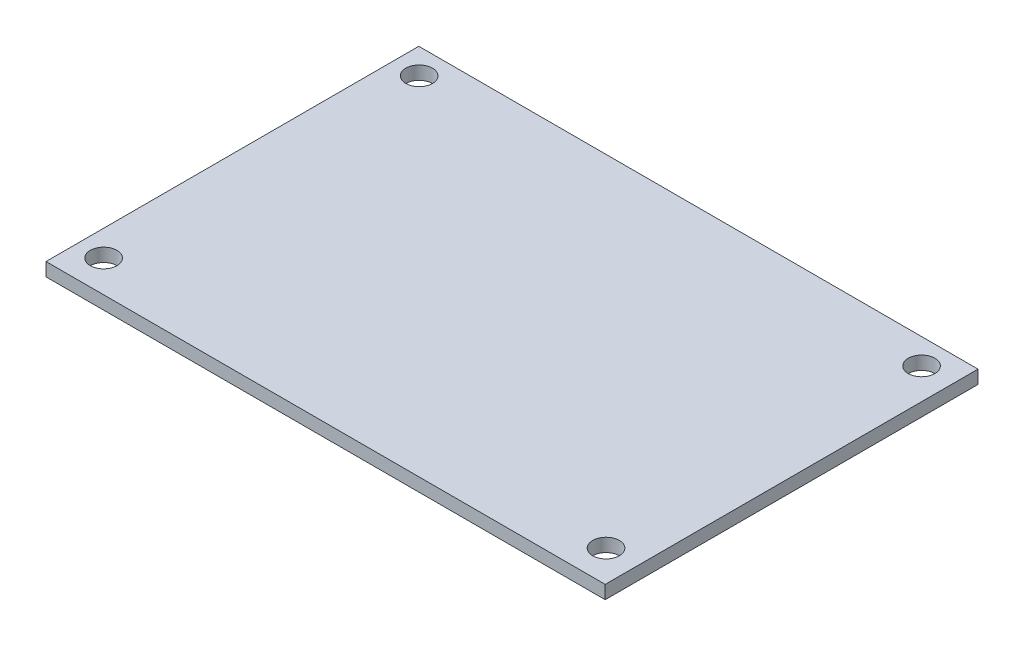
ISO-10303-21;
HEADER;
FILE_DESCRIPTION(('STEP AP214'),'2;1');
FILE_NAME('part.step','',(''),(''),'','','');
FILE_SCHEMA(('AUTOMOTIVE_DESIGN { 1 0 10303 214 1 1 1 1 }'));
ENDSEC;
DATA;
#1=APPLICATION_CONTEXT('core data for automotive mechanical design processes');
#2=APPLICATION_PROTOCOL_DEFINITION('international standard','automotive_design',2000,#1);
#3=PRODUCT_CONTEXT('',#1,'mechanical');
#4=PRODUCT('Part','Part','',(#3));
#5=PRODUCT_RELATED_PRODUCT_CATEGORY('part','',(#4));
#6=PRODUCT_DEFINITION_FORMATION('','',#4);
#7=PRODUCT_DEFINITION_CONTEXT('part definition',#1,'design');
#8=PRODUCT_DEFINITION('design','',#6,#7);
#9=PRODUCT_DEFINITION_SHAPE('','',#8);
#10=(LENGTH_UNIT() NAMED_UNIT(*) SI_UNIT(.MILLI.,.METRE.));
#11=(NAMED_UNIT(*) PLANE_ANGLE_UNIT() SI_UNIT($,.RADIAN.));
#12=(NAMED_UNIT(*) SI_UNIT($,.STERADIAN.) SOLID_ANGLE_UNIT());
#13=UNCERTAINTY_MEASURE_WITH_UNIT(LENGTH_MEASURE(1.E-05),#10,'distance_accuracy_value','');
#14=(GEOMETRIC_REPRESENTATION_CONTEXT(3) GLOBAL_UNCERTAINTY_ASSIGNED_CONTEXT((#13)) GLOBAL_UNIT_ASSIGNED_CONTEXT((#10,
#11,#12)) REPRESENTATION_CONTEXT('',''));
#15=CARTESIAN_POINT('',(0.,0.,0.));
#16=DIRECTION('',(0.,0.,1.));
#17=DIRECTION('',(1.,0.,0.));
#18=AXIS2_PLACEMENT_3D('',#15,#16,#17);
#19=CARTESIAN_POINT('',(31.5,1.5,-21.));
#20=DIRECTION('',(-1.,0.,0.));
#21=DIRECTION('',(0.,0.,1.));
#22=AXIS2_PLACEMENT_3D('',#19,#20,#21);
#23=PLANE('',#22);
#24=DIRECTION('',(0.,0.,-1.));
#25=VECTOR('',#24,1.);
#26=CARTESIAN_POINT('',(31.5,0.,-21.));
#27=LINE('',#26,#25);
#28=CARTESIAN_POINT('',(31.5,0.,21.));
#29=VERTEX_POINT('',#28);
#30=CARTESIAN_POINT('',(31.5,0.,-21.));
#31=VERTEX_POINT('',#30);
#32=EDGE_CURVE('E98',#29,#31,#27,.T.);
#33=ORIENTED_EDGE('',*,*,#32,.T.);
#34=DIRECTION('',(0.,-1.,0.));
#35=VECTOR('',#34,1.);
#36=CARTESIAN_POINT('',(31.5,1.5,-21.));
#37=LINE('',#36,#35);
#38=CARTESIAN_POINT('',(31.5,1.5,-21.));
#39=VERTEX_POINT('',#38);
#40=EDGE_CURVE('E11',#39,#31,#37,.T.);
#41=ORIENTED_EDGE('',*,*,#40,.F.);
#42=DIRECTION('',(0.,0.,-1.));
#43=VECTOR('',#42,1.);
#44=CARTESIAN_POINT('',(31.5,1.5,-21.));
#45=LINE('',#44,#43);
#46=CARTESIAN_POINT('',(31.5,1.5,21.));
#47=VERTEX_POINT('',#46);
#48=EDGE_CURVE('E86',#47,#39,#45,.T.);
#49=ORIENTED_EDGE('',*,*,#48,.F.);
#50=DIRECTION('',(0.,-1.,0.));
#51=VECTOR('',#50,1.);
#52=CARTESIAN_POINT('',(31.5,1.5,21.));
#53=LINE('',#52,#51);
#54=EDGE_CURVE('E94',#47,#29,#53,.T.);
#55=ORIENTED_EDGE('',*,*,#54,.T.);
#56=EDGE_LOOP('',(#33,#41,#49,#55));
#57=FACE_BOUND('',#56,.T.);
#58=ADVANCED_FACE('F35',(#57),#23,.F.);
#59=CARTESIAN_POINT('',(-31.5,1.5,-21.));
#60=DIRECTION('',(0.,0.,1.));
#61=DIRECTION('',(1.,0.,0.));
#62=AXIS2_PLACEMENT_3D('',#59,#60,#61);
#63=PLANE('',#62);
#64=DIRECTION('',(-1.,0.,0.));
#65=VECTOR('',#64,1.);
#66=CARTESIAN_POINT('',(-31.5,0.,-21.));
#67=LINE('',#66,#65);
#68=CARTESIAN_POINT('',(-31.5,0.,-21.));
#69=VERTEX_POINT('',#68);
#70=EDGE_CURVE('E90',#31,#69,#67,.T.);
#71=ORIENTED_EDGE('',*,*,#70,.T.);
#72=DIRECTION('',(0.,-1.,0.));
#73=VECTOR('',#72,1.);
#74=CARTESIAN_POINT('',(-31.5,1.5,-21.));
#75=LINE('',#74,#73);
#76=CARTESIAN_POINT('',(-31.5,1.5,-21.));
#77=VERTEX_POINT('',#76);
#78=EDGE_CURVE('E43',#77,#69,#75,.T.);
#79=ORIENTED_EDGE('',*,*,#78,.F.);
#80=DIRECTION('',(-1.,0.,0.));
#81=VECTOR('',#80,1.);
#82=CARTESIAN_POINT('',(-31.5,1.5,-21.));
#83=LINE('',#82,#81);
#84=EDGE_CURVE('E81',#39,#77,#83,.T.);
#85=ORIENTED_EDGE('',*,*,#84,.F.);
#86=ORIENTED_EDGE('',*,*,#40,.T.);
#87=EDGE_LOOP('',(#71,#79,#85,#86));
#88=FACE_BOUND('',#87,.T.);
#89=ADVANCED_FACE('F89',(#88),#63,.F.);
#90=CARTESIAN_POINT('',(-31.5,1.5,-21.));
#91=DIRECTION('',(1.,0.,0.));
#92=DIRECTION('',(0.,0.,-1.));
#93=AXIS2_PLACEMENT_3D('',#90,#91,#92);
#94=PLANE('',#93);
#95=DIRECTION('',(0.,0.,1.));
#96=VECTOR('',#95,1.);
#97=CARTESIAN_POINT('',(-31.5,0.,-21.));
#98=LINE('',#97,#96);
#99=CARTESIAN_POINT('',(-31.5,0.,21.));
#100=VERTEX_POINT('',#99);
#101=EDGE_CURVE('E68',#69,#100,#98,.T.);
#102=ORIENTED_EDGE('',*,*,#101,.T.);
#103=DIRECTION('',(0.,-1.,0.));
#104=VECTOR('',#103,1.);
#105=CARTESIAN_POINT('',(-31.5,1.5,21.));
#106=LINE('',#105,#104);
#107=CARTESIAN_POINT('',(-31.5,1.5,21.));
#108=VERTEX_POINT('',#107);
#109=EDGE_CURVE('E91',#108,#100,#106,.T.);
#110=ORIENTED_EDGE('',*,*,#109,.F.);
#111=DIRECTION('',(0.,0.,1.));
#112=VECTOR('',#111,1.);
#113=CARTESIAN_POINT('',(-31.5,1.5,-21.));
#114=LINE('',#113,#112);
#115=EDGE_CURVE('E84',#77,#108,#114,.T.);
#116=ORIENTED_EDGE('',*,*,#115,.F.);
#117=ORIENTED_EDGE('',*,*,#78,.T.);
#118=EDGE_LOOP('',(#102,#110,#116,#117));
#119=FACE_BOUND('',#118,.T.);
#120=ADVANCED_FACE('F92',(#119),#94,.F.);
#121=CARTESIAN_POINT('',(-31.5,1.5,21.));
#122=DIRECTION('',(0.,0.,-1.));
#123=DIRECTION('',(-1.,0.,0.));
#124=AXIS2_PLACEMENT_3D('',#121,#122,#123);
#125=PLANE('',#124);
#126=DIRECTION('',(1.,0.,0.));
#127=VECTOR('',#126,1.);
#128=CARTESIAN_POINT('',(-31.5,0.,21.));
#129=LINE('',#128,#127);
#130=EDGE_CURVE('E74',#100,#29,#129,.T.);
#131=ORIENTED_EDGE('',*,*,#130,.T.);
#132=ORIENTED_EDGE('',*,*,#54,.F.);
#133=DIRECTION('',(1.,0.,0.));
#134=VECTOR('',#133,1.);
#135=CARTESIAN_POINT('',(-31.5,1.5,21.));
#136=LINE('',#135,#134);
#137=EDGE_CURVE('E51',#108,#47,#136,.T.);
#138=ORIENTED_EDGE('',*,*,#137,.F.);
#139=ORIENTED_EDGE('',*,*,#109,.T.);
#140=EDGE_LOOP('',(#131,#132,#138,#139));
#141=FACE_BOUND('',#140,.T.);
#142=ADVANCED_FACE('F106',(#141),#125,.F.);
#143=CARTESIAN_POINT('',(0.,1.5,0.));
#144=DIRECTION('',(0.,1.,0.));
#145=DIRECTION('',(0.,0.,1.));
#146=AXIS2_PLACEMENT_3D('',#143,#144,#145);
#147=PLANE('',#146);
#148=CARTESIAN_POINT('',(-28.5975534976763,1.5,17.4143359028281));
#149=DIRECTION('',(0.,1.,0.));
#150=DIRECTION('',(0.,0.,1.));
#151=AXIS2_PLACEMENT_3D('',#148,#149,#150);
#152=CIRCLE('',#151,1.5);
#153=CARTESIAN_POINT('',(-28.5975534976763,1.5,18.9143359028281));
#154=VERTEX_POINT('',#153);
#155=EDGE_CURVE('E130',#154,#154,#152,.T.);
#156=ORIENTED_EDGE('',*,*,#155,.F.);
#157=EDGE_LOOP('',(#156));
#158=FACE_BOUND('',#157,.T.);
#159=CARTESIAN_POINT('',(28.007237026394,1.5,17.4143359028281));
#160=DIRECTION('',(0.,1.,0.));
#161=DIRECTION('',(0.,0.,1.));
#162=AXIS2_PLACEMENT_3D('',#159,#160,#161);
#163=CIRCLE('',#162,1.5);
#164=CARTESIAN_POINT('',(28.007237026394,1.5,18.9143359028281));
#165=VERTEX_POINT('',#164);
#166=EDGE_CURVE('E124',#165,#165,#163,.T.);
#167=ORIENTED_EDGE('',*,*,#166,.F.);
#168=EDGE_LOOP('',(#167));
#169=FACE_BOUND('',#168,.T.);
#170=CARTESIAN_POINT('',(28.007237026394,1.5,-18.1358338121731));
#171=DIRECTION('',(0.,1.,0.));
#172=DIRECTION('',(0.,0.,1.));
#173=AXIS2_PLACEMENT_3D('',#170,#171,#172);
#174=CIRCLE('',#173,1.5);
#175=CARTESIAN_POINT('',(28.007237026394,1.5,-16.6358338121731));
#176=VERTEX_POINT('',#175);
#177=EDGE_CURVE('E118',#176,#176,#174,.T.);
#178=ORIENTED_EDGE('',*,*,#177,.F.);
#179=EDGE_LOOP('',(#178));
#180=FACE_BOUND('',#179,.T.);
#181=CARTESIAN_POINT('',(-28.5975534976763,1.5,-18.1358338121731));
#182=DIRECTION('',(0.,1.,0.));
#183=DIRECTION('',(0.,0.,1.));
#184=AXIS2_PLACEMENT_3D('',#181,#182,#183);
#185=CIRCLE('',#184,1.5);
#186=CARTESIAN_POINT('',(-28.5975534976763,1.5,-16.6358338121731));
#187=VERTEX_POINT('',#186);
#188=EDGE_CURVE('E112',#187,#187,#185,.T.);
#189=ORIENTED_EDGE('',*,*,#188,.F.);
#190=EDGE_LOOP('',(#189));
#191=FACE_BOUND('',#190,.T.);
#192=ORIENTED_EDGE('',*,*,#48,.T.);
#193=ORIENTED_EDGE('',*,*,#84,.T.);
#194=ORIENTED_EDGE('',*,*,#115,.T.);
#195=ORIENTED_EDGE('',*,*,#137,.T.);
#196=EDGE_LOOP('',(#192,#193,#194,#195));
#197=FACE_BOUND('',#196,.T.);
#198=ADVANCED_FACE('F82',(#158,#169,#180,#191,#197),#147,.T.);
#199=CARTESIAN_POINT('',(0.,0.,0.));
#200=DIRECTION('',(0.,1.,0.));
#201=DIRECTION('',(0.,0.,1.));
#202=AXIS2_PLACEMENT_3D('',#199,#200,#201);
#203=PLANE('',#202);
#204=CARTESIAN_POINT('',(-28.5975534976763,0.,17.4143359028281));
#205=DIRECTION('',(0.,1.,0.));
#206=DIRECTION('',(0.,0.,1.));
#207=AXIS2_PLACEMENT_3D('',#204,#205,#206);
#208=CIRCLE('',#207,1.5);
#209=CARTESIAN_POINT('',(-28.5975534976763,0.,18.9143359028281));
#210=VERTEX_POINT('',#209);
#211=EDGE_CURVE('E127',#210,#210,#208,.T.);
#212=ORIENTED_EDGE('',*,*,#211,.T.);
#213=EDGE_LOOP('',(#212));
#214=FACE_BOUND('',#213,.T.);
#215=CARTESIAN_POINT('',(28.007237026394,0.,17.4143359028281));
#216=DIRECTION('',(0.,1.,0.));
#217=DIRECTION('',(0.,0.,1.));
#218=AXIS2_PLACEMENT_3D('',#215,#216,#217);
#219=CIRCLE('',#218,1.5);
#220=CARTESIAN_POINT('',(28.007237026394,0.,18.9143359028281));
#221=VERTEX_POINT('',#220);
#222=EDGE_CURVE('E121',#221,#221,#219,.T.);
#223=ORIENTED_EDGE('',*,*,#222,.T.);
#224=EDGE_LOOP('',(#223));
#225=FACE_BOUND('',#224,.T.);
#226=CARTESIAN_POINT('',(28.007237026394,0.,-18.1358338121731));
#227=DIRECTION('',(0.,1.,0.));
#228=DIRECTION('',(0.,0.,1.));
#229=AXIS2_PLACEMENT_3D('',#226,#227,#228);
#230=CIRCLE('',#229,1.5);
#231=CARTESIAN_POINT('',(28.007237026394,0.,-16.6358338121731));
#232=VERTEX_POINT('',#231);
#233=EDGE_CURVE('E115',#232,#232,#230,.T.);
#234=ORIENTED_EDGE('',*,*,#233,.T.);
#235=EDGE_LOOP('',(#234));
#236=FACE_BOUND('',#235,.T.);
#237=CARTESIAN_POINT('',(-28.5975534976763,0.,-18.1358338121731));
#238=DIRECTION('',(0.,1.,0.));
#239=DIRECTION('',(0.,0.,1.));
#240=AXIS2_PLACEMENT_3D('',#237,#238,#239);
#241=CIRCLE('',#240,1.5);
#242=CARTESIAN_POINT('',(-28.5975534976763,0.,-16.6358338121731));
#243=VERTEX_POINT('',#242);
#244=EDGE_CURVE('E101',#243,#243,#241,.T.);
#245=ORIENTED_EDGE('',*,*,#244,.T.);
#246=EDGE_LOOP('',(#245));
#247=FACE_BOUND('',#246,.T.);
#248=ORIENTED_EDGE('',*,*,#32,.F.);
#249=ORIENTED_EDGE('',*,*,#130,.F.);
#250=ORIENTED_EDGE('',*,*,#101,.F.);
#251=ORIENTED_EDGE('',*,*,#70,.F.);
#252=EDGE_LOOP('',(#248,#249,#250,#251));
#253=FACE_BOUND('',#252,.T.);
#254=ADVANCED_FACE('F109',(#214,#225,#236,#247,#253),#203,.F.);
#255=CARTESIAN_POINT('',(-28.5975534976763,0.,-18.1358338121731));
#256=DIRECTION('',(0.,1.,0.));
#257=DIRECTION('',(0.,0.,1.));
#258=AXIS2_PLACEMENT_3D('',#255,#256,#257);
#259=CYLINDRICAL_SURFACE('',#258,1.5);
#260=ORIENTED_EDGE('',*,*,#244,.F.);
#261=EDGE_LOOP('',(#260));
#262=FACE_BOUND('',#261,.T.);
#263=ORIENTED_EDGE('',*,*,#188,.T.);
#264=EDGE_LOOP('',(#263));
#265=FACE_BOUND('',#264,.T.);
#266=ADVANCED_FACE('F154',(#262,#265),#259,.F.);
#267=CARTESIAN_POINT('',(28.007237026394,0.,-18.1358338121731));
#268=DIRECTION('',(0.,1.,0.));
#269=DIRECTION('',(0.,0.,1.));
#270=AXIS2_PLACEMENT_3D('',#267,#268,#269);
#271=CYLINDRICAL_SURFACE('',#270,1.5);
#272=ORIENTED_EDGE('',*,*,#233,.F.);
#273=EDGE_LOOP('',(#272));
#274=FACE_BOUND('',#273,.T.);
#275=ORIENTED_EDGE('',*,*,#177,.T.);
#276=EDGE_LOOP('',(#275));
#277=FACE_BOUND('',#276,.T.);
#278=ADVANCED_FACE('F156',(#274,#277),#271,.F.);
#279=CARTESIAN_POINT('',(28.007237026394,0.,17.4143359028281));
#280=DIRECTION('',(0.,1.,0.));
#281=DIRECTION('',(0.,0.,1.));
#282=AXIS2_PLACEMENT_3D('',#279,#280,#281);
#283=CYLINDRICAL_SURFACE('',#282,1.5);
#284=ORIENTED_EDGE('',*,*,#222,.F.);
#285=EDGE_LOOP('',(#284));
#286=FACE_BOUND('',#285,.T.);
#287=ORIENTED_EDGE('',*,*,#166,.T.);
#288=EDGE_LOOP('',(#287));
#289=FACE_BOUND('',#288,.T.);
#290=ADVANCED_FACE('F141',(#286,#289),#283,.F.);
#291=CARTESIAN_POINT('',(-28.5975534976763,0.,17.4143359028281));
#292=DIRECTION('',(0.,1.,0.));
#293=DIRECTION('',(0.,0.,1.));
#294=AXIS2_PLACEMENT_3D('',#291,#292,#293);
#295=CYLINDRICAL_SURFACE('',#294,1.5);
#296=ORIENTED_EDGE('',*,*,#211,.F.);
#297=EDGE_LOOP('',(#296));
#298=FACE_BOUND('',#297,.T.);
#299=ORIENTED_EDGE('',*,*,#155,.T.);
#300=EDGE_LOOP('',(#299));
#301=FACE_BOUND('',#300,.T.);
#302=ADVANCED_FACE('F138',(#298,#301),#295,.F.);
#303=CLOSED_SHELL('',(#58,#89,#120,#142,#198,#254,#266,#278,#290,#302));
#304=MANIFOLD_SOLID_BREP('B2',#303);
#305=ADVANCED_BREP_SHAPE_REPRESENTATION('',(#18,#304),#14);
#306=SHAPE_DEFINITION_REPRESENTATION(#9,#305);
ENDSEC;
END-ISO-10303-21;
